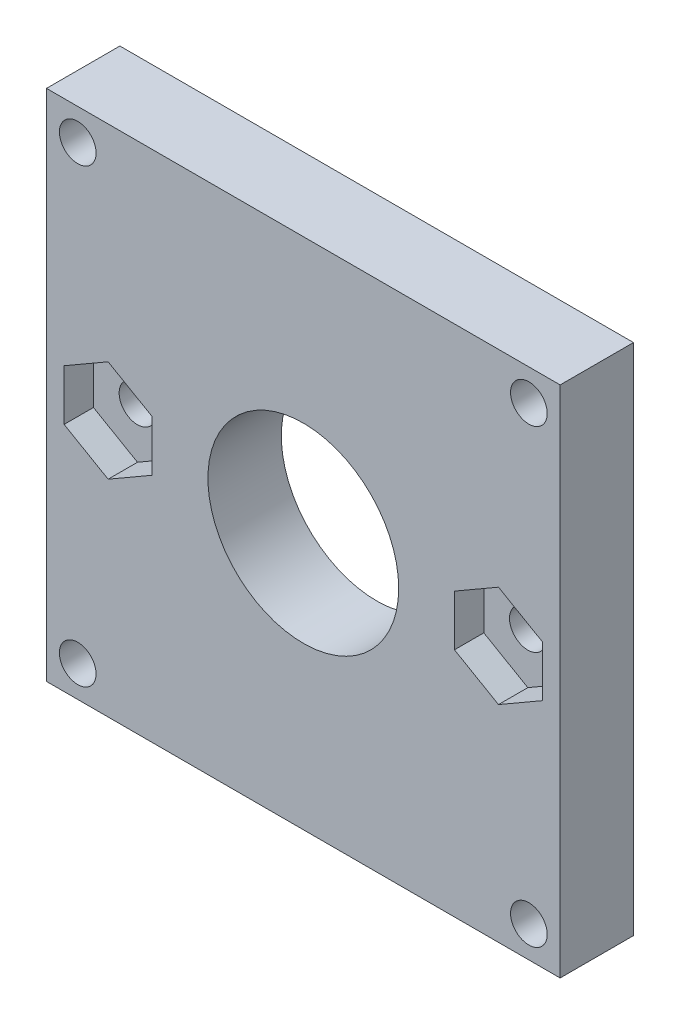
ISO-10303-21;
HEADER;
FILE_DESCRIPTION(('STEP AP214'),'2;1');
FILE_NAME('part.step','',(''),(''),'','','');
FILE_SCHEMA(('AUTOMOTIVE_DESIGN { 1 0 10303 214 1 1 1 1 }'));
ENDSEC;
DATA;
#1=APPLICATION_CONTEXT('core data for automotive mechanical design processes');
#2=APPLICATION_PROTOCOL_DEFINITION('international standard','automotive_design',2000,#1);
#3=PRODUCT_CONTEXT('',#1,'mechanical');
#4=PRODUCT('Part','Part','',(#3));
#5=PRODUCT_RELATED_PRODUCT_CATEGORY('part','',(#4));
#6=PRODUCT_DEFINITION_FORMATION('','',#4);
#7=PRODUCT_DEFINITION_CONTEXT('part definition',#1,'design');
#8=PRODUCT_DEFINITION('design','',#6,#7);
#9=PRODUCT_DEFINITION_SHAPE('','',#8);
#10=(LENGTH_UNIT() NAMED_UNIT(*) SI_UNIT(.MILLI.,.METRE.));
#11=(NAMED_UNIT(*) PLANE_ANGLE_UNIT() SI_UNIT($,.RADIAN.));
#12=(NAMED_UNIT(*) SI_UNIT($,.STERADIAN.) SOLID_ANGLE_UNIT());
#13=UNCERTAINTY_MEASURE_WITH_UNIT(LENGTH_MEASURE(1.E-05),#10,'distance_accuracy_value','');
#14=(GEOMETRIC_REPRESENTATION_CONTEXT(3) GLOBAL_UNCERTAINTY_ASSIGNED_CONTEXT((#13)) GLOBAL_UNIT_ASSIGNED_CONTEXT((#10,
#11,#12)) REPRESENTATION_CONTEXT('',''));
#15=CARTESIAN_POINT('',(0.,0.,0.));
#16=DIRECTION('',(0.,0.,1.));
#17=DIRECTION('',(1.,0.,0.));
#18=AXIS2_PLACEMENT_3D('',#15,#16,#17);
#19=CARTESIAN_POINT('',(-13.3,0.,5.));
#20=DIRECTION('',(0.,0.,-1.));
#21=DIRECTION('',(-1.,0.,0.));
#22=AXIS2_PLACEMENT_3D('',#19,#20,#21);
#23=CYLINDRICAL_SURFACE('',#22,1.25);
#24=CARTESIAN_POINT('',(-13.3,0.,0.));
#25=DIRECTION('',(0.,0.,1.));
#26=DIRECTION('',(1.,0.,0.));
#27=AXIS2_PLACEMENT_3D('',#24,#25,#26);
#28=CIRCLE('',#27,1.25);
#29=CARTESIAN_POINT('',(-12.05,0.,0.));
#30=VERTEX_POINT('',#29);
#31=EDGE_CURVE('E282',#30,#30,#28,.T.);
#32=ORIENTED_EDGE('',*,*,#31,.F.);
#33=EDGE_LOOP('',(#32));
#34=FACE_BOUND('',#33,.T.);
#35=CARTESIAN_POINT('',(-13.3,0.,3.));
#36=DIRECTION('',(0.,0.,1.));
#37=DIRECTION('',(1.,0.,0.));
#38=AXIS2_PLACEMENT_3D('',#35,#36,#37);
#39=CIRCLE('',#38,1.25);
#40=CARTESIAN_POINT('',(-12.05,0.,3.));
#41=VERTEX_POINT('',#40);
#42=EDGE_CURVE('E37',#41,#41,#39,.T.);
#43=ORIENTED_EDGE('',*,*,#42,.T.);
#44=EDGE_LOOP('',(#43));
#45=FACE_BOUND('',#44,.T.);
#46=ADVANCED_FACE('F33',(#34,#45),#23,.F.);
#47=CARTESIAN_POINT('',(13.3,0.,5.));
#48=DIRECTION('',(0.,0.,-1.));
#49=DIRECTION('',(-1.,0.,0.));
#50=AXIS2_PLACEMENT_3D('',#47,#48,#49);
#51=CYLINDRICAL_SURFACE('',#50,1.25);
#52=CARTESIAN_POINT('',(13.3,0.,0.));
#53=DIRECTION('',(0.,0.,1.));
#54=DIRECTION('',(1.,0.,0.));
#55=AXIS2_PLACEMENT_3D('',#52,#53,#54);
#56=CIRCLE('',#55,1.25);
#57=CARTESIAN_POINT('',(14.55,0.,0.));
#58=VERTEX_POINT('',#57);
#59=EDGE_CURVE('E279',#58,#58,#56,.T.);
#60=ORIENTED_EDGE('',*,*,#59,.F.);
#61=EDGE_LOOP('',(#60));
#62=FACE_BOUND('',#61,.T.);
#63=CARTESIAN_POINT('',(13.3,0.,3.));
#64=DIRECTION('',(0.,0.,1.));
#65=DIRECTION('',(1.,0.,0.));
#66=AXIS2_PLACEMENT_3D('',#63,#64,#65);
#67=CIRCLE('',#66,1.25);
#68=CARTESIAN_POINT('',(14.55,0.,3.));
#69=VERTEX_POINT('',#68);
#70=EDGE_CURVE('E195',#69,#69,#67,.T.);
#71=ORIENTED_EDGE('',*,*,#70,.T.);
#72=EDGE_LOOP('',(#71));
#73=FACE_BOUND('',#72,.T.);
#74=ADVANCED_FACE('F328',(#62,#73),#51,.F.);
#75=CARTESIAN_POINT('',(-17.5,0.,5.));
#76=DIRECTION('',(-1.,0.,0.));
#77=DIRECTION('',(0.,0.,1.));
#78=AXIS2_PLACEMENT_3D('',#75,#76,#77);
#79=PLANE('',#78);
#80=DIRECTION('',(0.,1.,0.));
#81=VECTOR('',#80,1.);
#82=CARTESIAN_POINT('',(-17.5,0.,0.));
#83=LINE('',#82,#81);
#84=CARTESIAN_POINT('',(-17.5,-17.5,0.));
#85=VERTEX_POINT('',#84);
#86=CARTESIAN_POINT('',(-17.5,17.5,0.));
#87=VERTEX_POINT('',#86);
#88=EDGE_CURVE('E297',#85,#87,#83,.T.);
#89=ORIENTED_EDGE('',*,*,#88,.F.);
#90=DIRECTION('',(0.,0.,-1.));
#91=VECTOR('',#90,1.);
#92=CARTESIAN_POINT('',(-17.5,-17.5,5.));
#93=LINE('',#92,#91);
#94=CARTESIAN_POINT('',(-17.5,-17.5,5.));
#95=VERTEX_POINT('',#94);
#96=EDGE_CURVE('E11',#95,#85,#93,.T.);
#97=ORIENTED_EDGE('',*,*,#96,.F.);
#98=DIRECTION('',(0.,1.,0.));
#99=VECTOR('',#98,1.);
#100=CARTESIAN_POINT('',(-17.5,0.,5.));
#101=LINE('',#100,#99);
#102=CARTESIAN_POINT('',(-17.5,17.5,5.));
#103=VERTEX_POINT('',#102);
#104=EDGE_CURVE('E264',#95,#103,#101,.T.);
#105=ORIENTED_EDGE('',*,*,#104,.T.);
#106=DIRECTION('',(0.,0.,-1.));
#107=VECTOR('',#106,1.);
#108=CARTESIAN_POINT('',(-17.5,17.5,5.));
#109=LINE('',#108,#107);
#110=EDGE_CURVE('E275',#103,#87,#109,.T.);
#111=ORIENTED_EDGE('',*,*,#110,.T.);
#112=EDGE_LOOP('',(#89,#97,#105,#111));
#113=FACE_BOUND('',#112,.T.);
#114=ADVANCED_FACE('F335',(#113),#79,.T.);
#115=CARTESIAN_POINT('',(0.,-17.5,5.));
#116=DIRECTION('',(0.,-1.,0.));
#117=DIRECTION('',(0.,0.,-1.));
#118=AXIS2_PLACEMENT_3D('',#115,#116,#117);
#119=PLANE('',#118);
#120=DIRECTION('',(-1.,0.,0.));
#121=VECTOR('',#120,1.);
#122=CARTESIAN_POINT('',(0.,-17.5,0.));
#123=LINE('',#122,#121);
#124=CARTESIAN_POINT('',(17.5,-17.5,0.));
#125=VERTEX_POINT('',#124);
#126=EDGE_CURVE('E300',#125,#85,#123,.T.);
#127=ORIENTED_EDGE('',*,*,#126,.F.);
#128=DIRECTION('',(0.,0.,-1.));
#129=VECTOR('',#128,1.);
#130=CARTESIAN_POINT('',(17.5,-17.5,5.));
#131=LINE('',#130,#129);
#132=CARTESIAN_POINT('',(17.5,-17.5,5.));
#133=VERTEX_POINT('',#132);
#134=EDGE_CURVE('E42',#133,#125,#131,.T.);
#135=ORIENTED_EDGE('',*,*,#134,.F.);
#136=DIRECTION('',(-1.,0.,0.));
#137=VECTOR('',#136,1.);
#138=CARTESIAN_POINT('',(0.,-17.5,5.));
#139=LINE('',#138,#137);
#140=EDGE_CURVE('E267',#133,#95,#139,.T.);
#141=ORIENTED_EDGE('',*,*,#140,.T.);
#142=ORIENTED_EDGE('',*,*,#96,.T.);
#143=EDGE_LOOP('',(#127,#135,#141,#142));
#144=FACE_BOUND('',#143,.T.);
#145=ADVANCED_FACE('F358',(#144),#119,.T.);
#146=CARTESIAN_POINT('',(17.5,0.,5.));
#147=DIRECTION('',(-1.,0.,0.));
#148=DIRECTION('',(0.,0.,1.));
#149=AXIS2_PLACEMENT_3D('',#146,#147,#148);
#150=PLANE('',#149);
#151=DIRECTION('',(0.,1.,0.));
#152=VECTOR('',#151,1.);
#153=CARTESIAN_POINT('',(17.5,0.,0.));
#154=LINE('',#153,#152);
#155=CARTESIAN_POINT('',(17.5,17.5,0.));
#156=VERTEX_POINT('',#155);
#157=EDGE_CURVE('E303',#125,#156,#154,.T.);
#158=ORIENTED_EDGE('',*,*,#157,.T.);
#159=DIRECTION('',(0.,0.,-1.));
#160=VECTOR('',#159,1.);
#161=CARTESIAN_POINT('',(17.5,17.5,5.));
#162=LINE('',#161,#160);
#163=CARTESIAN_POINT('',(17.5,17.5,5.));
#164=VERTEX_POINT('',#163);
#165=EDGE_CURVE('E309',#164,#156,#162,.T.);
#166=ORIENTED_EDGE('',*,*,#165,.F.);
#167=DIRECTION('',(0.,1.,0.));
#168=VECTOR('',#167,1.);
#169=CARTESIAN_POINT('',(17.5,0.,5.));
#170=LINE('',#169,#168);
#171=EDGE_CURVE('E270',#133,#164,#170,.T.);
#172=ORIENTED_EDGE('',*,*,#171,.F.);
#173=ORIENTED_EDGE('',*,*,#134,.T.);
#174=EDGE_LOOP('',(#158,#166,#172,#173));
#175=FACE_BOUND('',#174,.T.);
#176=ADVANCED_FACE('F354',(#175),#150,.F.);
#177=CARTESIAN_POINT('',(-15.37,15.37,5.));
#178=DIRECTION('',(0.,0.,-1.));
#179=DIRECTION('',(-1.,0.,0.));
#180=AXIS2_PLACEMENT_3D('',#177,#178,#179);
#181=CYLINDRICAL_SURFACE('',#180,1.25);
#182=CARTESIAN_POINT('',(-15.37,15.37,5.));
#183=DIRECTION('',(0.,0.,1.));
#184=DIRECTION('',(1.,0.,0.));
#185=AXIS2_PLACEMENT_3D('',#182,#183,#184);
#186=CIRCLE('',#185,1.25);
#187=CARTESIAN_POINT('',(-14.12,15.37,5.));
#188=VERTEX_POINT('',#187);
#189=EDGE_CURVE('E261',#188,#188,#186,.T.);
#190=ORIENTED_EDGE('',*,*,#189,.T.);
#191=EDGE_LOOP('',(#190));
#192=FACE_BOUND('',#191,.T.);
#193=CARTESIAN_POINT('',(-15.37,15.37,0.));
#194=DIRECTION('',(0.,0.,1.));
#195=DIRECTION('',(1.,0.,0.));
#196=AXIS2_PLACEMENT_3D('',#193,#194,#195);
#197=CIRCLE('',#196,1.25);
#198=CARTESIAN_POINT('',(-14.12,15.37,0.));
#199=VERTEX_POINT('',#198);
#200=EDGE_CURVE('E294',#199,#199,#197,.T.);
#201=ORIENTED_EDGE('',*,*,#200,.F.);
#202=EDGE_LOOP('',(#201));
#203=FACE_BOUND('',#202,.T.);
#204=ADVANCED_FACE('F350',(#192,#203),#181,.F.);
#205=CARTESIAN_POINT('',(15.37,15.37,5.));
#206=DIRECTION('',(0.,0.,-1.));
#207=DIRECTION('',(-1.,0.,0.));
#208=AXIS2_PLACEMENT_3D('',#205,#206,#207);
#209=CYLINDRICAL_SURFACE('',#208,1.25);
#210=CARTESIAN_POINT('',(15.37,15.37,5.));
#211=DIRECTION('',(0.,0.,1.));
#212=DIRECTION('',(1.,0.,0.));
#213=AXIS2_PLACEMENT_3D('',#210,#211,#212);
#214=CIRCLE('',#213,1.25);
#215=CARTESIAN_POINT('',(16.62,15.37,5.));
#216=VERTEX_POINT('',#215);
#217=EDGE_CURVE('E258',#216,#216,#214,.T.);
#218=ORIENTED_EDGE('',*,*,#217,.T.);
#219=EDGE_LOOP('',(#218));
#220=FACE_BOUND('',#219,.T.);
#221=CARTESIAN_POINT('',(15.37,15.37,0.));
#222=DIRECTION('',(0.,0.,1.));
#223=DIRECTION('',(1.,0.,0.));
#224=AXIS2_PLACEMENT_3D('',#221,#222,#223);
#225=CIRCLE('',#224,1.25);
#226=CARTESIAN_POINT('',(16.62,15.37,0.));
#227=VERTEX_POINT('',#226);
#228=EDGE_CURVE('E291',#227,#227,#225,.T.);
#229=ORIENTED_EDGE('',*,*,#228,.F.);
#230=EDGE_LOOP('',(#229));
#231=FACE_BOUND('',#230,.T.);
#232=ADVANCED_FACE('F346',(#220,#231),#209,.F.);
#233=CARTESIAN_POINT('',(15.37,-15.37,5.));
#234=DIRECTION('',(0.,0.,-1.));
#235=DIRECTION('',(-1.,0.,0.));
#236=AXIS2_PLACEMENT_3D('',#233,#234,#235);
#237=CYLINDRICAL_SURFACE('',#236,1.25);
#238=CARTESIAN_POINT('',(15.37,-15.37,5.));
#239=DIRECTION('',(0.,0.,1.));
#240=DIRECTION('',(1.,0.,0.));
#241=AXIS2_PLACEMENT_3D('',#238,#239,#240);
#242=CIRCLE('',#241,1.25);
#243=CARTESIAN_POINT('',(16.62,-15.37,5.));
#244=VERTEX_POINT('',#243);
#245=EDGE_CURVE('E255',#244,#244,#242,.T.);
#246=ORIENTED_EDGE('',*,*,#245,.T.);
#247=EDGE_LOOP('',(#246));
#248=FACE_BOUND('',#247,.T.);
#249=CARTESIAN_POINT('',(15.37,-15.37,0.));
#250=DIRECTION('',(0.,0.,1.));
#251=DIRECTION('',(1.,0.,0.));
#252=AXIS2_PLACEMENT_3D('',#249,#250,#251);
#253=CIRCLE('',#252,1.25);
#254=CARTESIAN_POINT('',(16.62,-15.37,0.));
#255=VERTEX_POINT('',#254);
#256=EDGE_CURVE('E288',#255,#255,#253,.T.);
#257=ORIENTED_EDGE('',*,*,#256,.F.);
#258=EDGE_LOOP('',(#257));
#259=FACE_BOUND('',#258,.T.);
#260=ADVANCED_FACE('F342',(#248,#259),#237,.F.);
#261=CARTESIAN_POINT('',(-15.37,-15.37,5.));
#262=DIRECTION('',(0.,0.,-1.));
#263=DIRECTION('',(-1.,0.,0.));
#264=AXIS2_PLACEMENT_3D('',#261,#262,#263);
#265=CYLINDRICAL_SURFACE('',#264,1.25);
#266=CARTESIAN_POINT('',(-15.37,-15.37,5.));
#267=DIRECTION('',(0.,0.,1.));
#268=DIRECTION('',(1.,0.,0.));
#269=AXIS2_PLACEMENT_3D('',#266,#267,#268);
#270=CIRCLE('',#269,1.25);
#271=CARTESIAN_POINT('',(-14.12,-15.37,5.));
#272=VERTEX_POINT('',#271);
#273=EDGE_CURVE('E251',#272,#272,#270,.T.);
#274=ORIENTED_EDGE('',*,*,#273,.T.);
#275=EDGE_LOOP('',(#274));
#276=FACE_BOUND('',#275,.T.);
#277=CARTESIAN_POINT('',(-15.37,-15.37,0.));
#278=DIRECTION('',(0.,0.,1.));
#279=DIRECTION('',(1.,0.,0.));
#280=AXIS2_PLACEMENT_3D('',#277,#278,#279);
#281=CIRCLE('',#280,1.25);
#282=CARTESIAN_POINT('',(-14.12,-15.37,0.));
#283=VERTEX_POINT('',#282);
#284=EDGE_CURVE('E285',#283,#283,#281,.T.);
#285=ORIENTED_EDGE('',*,*,#284,.F.);
#286=EDGE_LOOP('',(#285));
#287=FACE_BOUND('',#286,.T.);
#288=ADVANCED_FACE('F339',(#276,#287),#265,.F.);
#289=CARTESIAN_POINT('',(0.,0.,5.));
#290=DIRECTION('',(0.,0.,-1.));
#291=DIRECTION('',(-1.,0.,0.));
#292=AXIS2_PLACEMENT_3D('',#289,#290,#291);
#293=CYLINDRICAL_SURFACE('',#292,6.5);
#294=CARTESIAN_POINT('',(0.,0.,5.));
#295=DIRECTION('',(0.,0.,1.));
#296=DIRECTION('',(1.,0.,0.));
#297=AXIS2_PLACEMENT_3D('',#294,#295,#296);
#298=CIRCLE('',#297,6.5);
#299=CARTESIAN_POINT('',(6.5,0.,5.));
#300=VERTEX_POINT('',#299);
#301=EDGE_CURVE('E248',#300,#300,#298,.T.);
#302=ORIENTED_EDGE('',*,*,#301,.T.);
#303=EDGE_LOOP('',(#302));
#304=FACE_BOUND('',#303,.T.);
#305=CARTESIAN_POINT('',(0.,0.,0.));
#306=DIRECTION('',(0.,0.,1.));
#307=DIRECTION('',(1.,0.,0.));
#308=AXIS2_PLACEMENT_3D('',#305,#306,#307);
#309=CIRCLE('',#308,6.5);
#310=CARTESIAN_POINT('',(6.5,0.,0.));
#311=VERTEX_POINT('',#310);
#312=EDGE_CURVE('E276',#311,#311,#309,.T.);
#313=ORIENTED_EDGE('',*,*,#312,.F.);
#314=EDGE_LOOP('',(#313));
#315=FACE_BOUND('',#314,.T.);
#316=ADVANCED_FACE('F35',(#304,#315),#293,.F.);
#317=CARTESIAN_POINT('',(0.,17.5,5.));
#318=DIRECTION('',(0.,-1.,0.));
#319=DIRECTION('',(0.,0.,-1.));
#320=AXIS2_PLACEMENT_3D('',#317,#318,#319);
#321=PLANE('',#320);
#322=DIRECTION('',(-1.,0.,0.));
#323=VECTOR('',#322,1.);
#324=CARTESIAN_POINT('',(0.,17.5,0.));
#325=LINE('',#324,#323);
#326=EDGE_CURVE('E252',#156,#87,#325,.T.);
#327=ORIENTED_EDGE('',*,*,#326,.T.);
#328=ORIENTED_EDGE('',*,*,#110,.F.);
#329=DIRECTION('',(-1.,0.,0.));
#330=VECTOR('',#329,1.);
#331=CARTESIAN_POINT('',(0.,17.5,5.));
#332=LINE('',#331,#330);
#333=EDGE_CURVE('E273',#164,#103,#332,.T.);
#334=ORIENTED_EDGE('',*,*,#333,.F.);
#335=ORIENTED_EDGE('',*,*,#165,.T.);
#336=EDGE_LOOP('',(#327,#328,#334,#335));
#337=FACE_BOUND('',#336,.T.);
#338=ADVANCED_FACE('F366',(#337),#321,.F.);
#339=CARTESIAN_POINT('',(0.,0.,5.));
#340=DIRECTION('',(0.,0.,1.));
#341=DIRECTION('',(1.,0.,0.));
#342=AXIS2_PLACEMENT_3D('',#339,#340,#341);
#343=PLANE('',#342);
#344=DIRECTION('',(-0.866025403784438,0.5,0.));
#345=VECTOR('',#344,1.);
#346=CARTESIAN_POINT('',(-10.3,1.73205080756888,5.));
#347=LINE('',#346,#345);
#348=CARTESIAN_POINT('',(-10.3,1.73205080756888,5.));
#349=VERTEX_POINT('',#348);
#350=CARTESIAN_POINT('',(-13.3,3.46410161513776,5.));
#351=VERTEX_POINT('',#350);
#352=EDGE_CURVE('E50',#349,#351,#347,.T.);
#353=ORIENTED_EDGE('',*,*,#352,.F.);
#354=DIRECTION('',(0.,1.,0.));
#355=VECTOR('',#354,1.);
#356=CARTESIAN_POINT('',(-10.3,-1.73205080756888,5.));
#357=LINE('',#356,#355);
#358=CARTESIAN_POINT('',(-10.3,-1.73205080756888,5.));
#359=VERTEX_POINT('',#358);
#360=EDGE_CURVE('E168',#359,#349,#357,.T.);
#361=ORIENTED_EDGE('',*,*,#360,.F.);
#362=DIRECTION('',(0.866025403784438,0.5,0.));
#363=VECTOR('',#362,1.);
#364=CARTESIAN_POINT('',(-13.3,-3.46410161513776,5.));
#365=LINE('',#364,#363);
#366=CARTESIAN_POINT('',(-13.3,-3.46410161513776,5.));
#367=VERTEX_POINT('',#366);
#368=EDGE_CURVE('E171',#367,#359,#365,.T.);
#369=ORIENTED_EDGE('',*,*,#368,.F.);
#370=DIRECTION('',(0.866025403784439,-0.5,0.));
#371=VECTOR('',#370,1.);
#372=CARTESIAN_POINT('',(-16.3,-1.73205080756888,5.));
#373=LINE('',#372,#371);
#374=CARTESIAN_POINT('',(-16.3,-1.73205080756888,5.));
#375=VERTEX_POINT('',#374);
#376=EDGE_CURVE('E188',#375,#367,#373,.T.);
#377=ORIENTED_EDGE('',*,*,#376,.F.);
#378=DIRECTION('',(0.,-1.,0.));
#379=VECTOR('',#378,1.);
#380=CARTESIAN_POINT('',(-16.3,1.73205080756888,5.));
#381=LINE('',#380,#379);
#382=CARTESIAN_POINT('',(-16.3,1.73205080756888,5.));
#383=VERTEX_POINT('',#382);
#384=EDGE_CURVE('E185',#383,#375,#381,.T.);
#385=ORIENTED_EDGE('',*,*,#384,.F.);
#386=DIRECTION('',(-0.866025403784439,-0.5,0.));
#387=VECTOR('',#386,1.);
#388=CARTESIAN_POINT('',(-13.3,3.46410161513776,5.));
#389=LINE('',#388,#387);
#390=EDGE_CURVE('E182',#351,#383,#389,.T.);
#391=ORIENTED_EDGE('',*,*,#390,.F.);
#392=EDGE_LOOP('',(#353,#361,#369,#377,#385,#391));
#393=FACE_BOUND('',#392,.T.);
#394=DIRECTION('',(-0.866025403784441,0.499999999999995,0.));
#395=VECTOR('',#394,1.);
#396=CARTESIAN_POINT('',(16.3,1.73205080756891,5.));
#397=LINE('',#396,#395);
#398=CARTESIAN_POINT('',(16.3,1.73205080756891,5.));
#399=VERTEX_POINT('',#398);
#400=CARTESIAN_POINT('',(13.3,3.46410161513776,5.));
#401=VERTEX_POINT('',#400);
#402=EDGE_CURVE('E58',#399,#401,#397,.T.);
#403=ORIENTED_EDGE('',*,*,#402,.F.);
#404=DIRECTION('',(0.,1.,0.));
#405=VECTOR('',#404,1.);
#406=CARTESIAN_POINT('',(16.3,-1.73205080756885,5.));
#407=LINE('',#406,#405);
#408=CARTESIAN_POINT('',(16.3,-1.73205080756885,5.));
#409=VERTEX_POINT('',#408);
#410=EDGE_CURVE('E207',#409,#399,#407,.T.);
#411=ORIENTED_EDGE('',*,*,#410,.F.);
#412=DIRECTION('',(0.866025403784434,0.500000000000007,0.));
#413=VECTOR('',#412,1.);
#414=CARTESIAN_POINT('',(13.3,-3.46410161513776,5.));
#415=LINE('',#414,#413);
#416=CARTESIAN_POINT('',(13.3,-3.46410161513776,5.));
#417=VERTEX_POINT('',#416);
#418=EDGE_CURVE('E233',#417,#409,#415,.T.);
#419=ORIENTED_EDGE('',*,*,#418,.F.);
#420=DIRECTION('',(0.866025403784441,-0.499999999999995,0.));
#421=VECTOR('',#420,1.);
#422=CARTESIAN_POINT('',(10.3,-1.73205080756889,5.));
#423=LINE('',#422,#421);
#424=CARTESIAN_POINT('',(10.3,-1.73205080756889,5.));
#425=VERTEX_POINT('',#424);
#426=EDGE_CURVE('E230',#425,#417,#423,.T.);
#427=ORIENTED_EDGE('',*,*,#426,.F.);
#428=DIRECTION('',(0.,-1.,0.));
#429=VECTOR('',#428,1.);
#430=CARTESIAN_POINT('',(10.3,1.73205080756887,5.));
#431=LINE('',#430,#429);
#432=CARTESIAN_POINT('',(10.3,1.73205080756887,5.));
#433=VERTEX_POINT('',#432);
#434=EDGE_CURVE('E227',#433,#425,#431,.T.);
#435=ORIENTED_EDGE('',*,*,#434,.F.);
#436=DIRECTION('',(-0.866025403784438,-0.500000000000001,0.));
#437=VECTOR('',#436,1.);
#438=CARTESIAN_POINT('',(13.3,3.46410161513776,5.));
#439=LINE('',#438,#437);
#440=EDGE_CURVE('E224',#401,#433,#439,.T.);
#441=ORIENTED_EDGE('',*,*,#440,.F.);
#442=EDGE_LOOP('',(#403,#411,#419,#427,#435,#441));
#443=FACE_BOUND('',#442,.T.);
#444=ORIENTED_EDGE('',*,*,#301,.F.);
#445=EDGE_LOOP('',(#444));
#446=FACE_BOUND('',#445,.T.);
#447=ORIENTED_EDGE('',*,*,#273,.F.);
#448=EDGE_LOOP('',(#447));
#449=FACE_BOUND('',#448,.T.);
#450=ORIENTED_EDGE('',*,*,#245,.F.);
#451=EDGE_LOOP('',(#450));
#452=FACE_BOUND('',#451,.T.);
#453=ORIENTED_EDGE('',*,*,#217,.F.);
#454=EDGE_LOOP('',(#453));
#455=FACE_BOUND('',#454,.T.);
#456=ORIENTED_EDGE('',*,*,#189,.F.);
#457=EDGE_LOOP('',(#456));
#458=FACE_BOUND('',#457,.T.);
#459=ORIENTED_EDGE('',*,*,#104,.F.);
#460=ORIENTED_EDGE('',*,*,#140,.F.);
#461=ORIENTED_EDGE('',*,*,#171,.T.);
#462=ORIENTED_EDGE('',*,*,#333,.T.);
#463=EDGE_LOOP('',(#459,#460,#461,#462));
#464=FACE_BOUND('',#463,.T.);
#465=ADVANCED_FACE('F369',(#393,#443,#446,#449,#452,#455,#458,#464),#343,.T.);
#466=CARTESIAN_POINT('',(0.,0.,0.));
#467=DIRECTION('',(0.,0.,1.));
#468=DIRECTION('',(1.,0.,0.));
#469=AXIS2_PLACEMENT_3D('',#466,#467,#468);
#470=PLANE('',#469);
#471=ORIENTED_EDGE('',*,*,#312,.T.);
#472=EDGE_LOOP('',(#471));
#473=FACE_BOUND('',#472,.T.);
#474=ORIENTED_EDGE('',*,*,#59,.T.);
#475=EDGE_LOOP('',(#474));
#476=FACE_BOUND('',#475,.T.);
#477=ORIENTED_EDGE('',*,*,#31,.T.);
#478=EDGE_LOOP('',(#477));
#479=FACE_BOUND('',#478,.T.);
#480=ORIENTED_EDGE('',*,*,#284,.T.);
#481=EDGE_LOOP('',(#480));
#482=FACE_BOUND('',#481,.T.);
#483=ORIENTED_EDGE('',*,*,#256,.T.);
#484=EDGE_LOOP('',(#483));
#485=FACE_BOUND('',#484,.T.);
#486=ORIENTED_EDGE('',*,*,#228,.T.);
#487=EDGE_LOOP('',(#486));
#488=FACE_BOUND('',#487,.T.);
#489=ORIENTED_EDGE('',*,*,#200,.T.);
#490=EDGE_LOOP('',(#489));
#491=FACE_BOUND('',#490,.T.);
#492=ORIENTED_EDGE('',*,*,#88,.T.);
#493=ORIENTED_EDGE('',*,*,#326,.F.);
#494=ORIENTED_EDGE('',*,*,#157,.F.);
#495=ORIENTED_EDGE('',*,*,#126,.T.);
#496=EDGE_LOOP('',(#492,#493,#494,#495));
#497=FACE_BOUND('',#496,.T.);
#498=ADVANCED_FACE('F371',(#473,#476,#479,#482,#485,#488,#491,#497),#470,.F.);
#499=CARTESIAN_POINT('',(16.3,1.73205080756891,3.));
#500=DIRECTION('',(0.499999999999995,0.866025403784441,0.));
#501=DIRECTION('',(-0.866025403784442,0.499999999999995,0.));
#502=AXIS2_PLACEMENT_3D('',#499,#500,#501);
#503=PLANE('',#502);
#504=ORIENTED_EDGE('',*,*,#402,.T.);
#505=DIRECTION('',(0.,0.,1.));
#506=VECTOR('',#505,1.);
#507=CARTESIAN_POINT('',(13.3,3.46410161513776,3.));
#508=LINE('',#507,#506);
#509=CARTESIAN_POINT('',(13.3,3.46410161513776,3.));
#510=VERTEX_POINT('',#509);
#511=EDGE_CURVE('E222',#510,#401,#508,.T.);
#512=ORIENTED_EDGE('',*,*,#511,.F.);
#513=DIRECTION('',(-0.866025403784441,0.499999999999995,0.));
#514=VECTOR('',#513,1.);
#515=CARTESIAN_POINT('',(16.3,1.73205080756891,3.));
#516=LINE('',#515,#514);
#517=CARTESIAN_POINT('',(16.3,1.73205080756891,3.));
#518=VERTEX_POINT('',#517);
#519=EDGE_CURVE('E203',#518,#510,#516,.T.);
#520=ORIENTED_EDGE('',*,*,#519,.F.);
#521=DIRECTION('',(0.,0.,1.));
#522=VECTOR('',#521,1.);
#523=CARTESIAN_POINT('',(16.3,1.73205080756891,3.));
#524=LINE('',#523,#522);
#525=EDGE_CURVE('E183',#518,#399,#524,.T.);
#526=ORIENTED_EDGE('',*,*,#525,.T.);
#527=EDGE_LOOP('',(#504,#512,#520,#526));
#528=FACE_BOUND('',#527,.T.);
#529=ADVANCED_FACE('F374',(#528),#503,.F.);
#530=CARTESIAN_POINT('',(16.3,-1.73205080756885,3.));
#531=DIRECTION('',(1.,0.,0.));
#532=DIRECTION('',(0.,1.,0.));
#533=AXIS2_PLACEMENT_3D('',#530,#531,#532);
#534=PLANE('',#533);
#535=ORIENTED_EDGE('',*,*,#410,.T.);
#536=ORIENTED_EDGE('',*,*,#525,.F.);
#537=DIRECTION('',(0.,1.,0.));
#538=VECTOR('',#537,1.);
#539=CARTESIAN_POINT('',(16.3,-1.73205080756885,3.));
#540=LINE('',#539,#538);
#541=CARTESIAN_POINT('',(16.3,-1.73205080756885,3.));
#542=VERTEX_POINT('',#541);
#543=EDGE_CURVE('E219',#542,#518,#540,.T.);
#544=ORIENTED_EDGE('',*,*,#543,.F.);
#545=DIRECTION('',(0.,0.,1.));
#546=VECTOR('',#545,1.);
#547=CARTESIAN_POINT('',(16.3,-1.73205080756885,3.));
#548=LINE('',#547,#546);
#549=EDGE_CURVE('E239',#542,#409,#548,.T.);
#550=ORIENTED_EDGE('',*,*,#549,.T.);
#551=EDGE_LOOP('',(#535,#536,#544,#550));
#552=FACE_BOUND('',#551,.T.);
#553=ADVANCED_FACE('F381',(#552),#534,.F.);
#554=CARTESIAN_POINT('',(13.3,-3.46410161513776,3.));
#555=DIRECTION('',(0.500000000000007,-0.866025403784434,0.));
#556=DIRECTION('',(0.866025403784435,0.500000000000007,0.));
#557=AXIS2_PLACEMENT_3D('',#554,#555,#556);
#558=PLANE('',#557);
#559=ORIENTED_EDGE('',*,*,#418,.T.);
#560=ORIENTED_EDGE('',*,*,#549,.F.);
#561=DIRECTION('',(0.866025403784434,0.500000000000007,0.));
#562=VECTOR('',#561,1.);
#563=CARTESIAN_POINT('',(13.3,-3.46410161513776,3.));
#564=LINE('',#563,#562);
#565=CARTESIAN_POINT('',(13.3,-3.46410161513776,3.));
#566=VERTEX_POINT('',#565);
#567=EDGE_CURVE('E216',#566,#542,#564,.T.);
#568=ORIENTED_EDGE('',*,*,#567,.F.);
#569=DIRECTION('',(0.,0.,1.));
#570=VECTOR('',#569,1.);
#571=CARTESIAN_POINT('',(13.3,-3.46410161513776,3.));
#572=LINE('',#571,#570);
#573=EDGE_CURVE('E241',#566,#417,#572,.T.);
#574=ORIENTED_EDGE('',*,*,#573,.T.);
#575=EDGE_LOOP('',(#559,#560,#568,#574));
#576=FACE_BOUND('',#575,.T.);
#577=ADVANCED_FACE('F394',(#576),#558,.F.);
#578=CARTESIAN_POINT('',(10.3,-1.73205080756889,3.));
#579=DIRECTION('',(-0.499999999999995,-0.866025403784442,0.));
#580=DIRECTION('',(0.866025403784442,-0.499999999999995,0.));
#581=AXIS2_PLACEMENT_3D('',#578,#579,#580);
#582=PLANE('',#581);
#583=ORIENTED_EDGE('',*,*,#426,.T.);
#584=ORIENTED_EDGE('',*,*,#573,.F.);
#585=DIRECTION('',(0.866025403784441,-0.499999999999995,0.));
#586=VECTOR('',#585,1.);
#587=CARTESIAN_POINT('',(10.3,-1.73205080756889,3.));
#588=LINE('',#587,#586);
#589=CARTESIAN_POINT('',(10.3,-1.73205080756889,3.));
#590=VERTEX_POINT('',#589);
#591=EDGE_CURVE('E213',#590,#566,#588,.T.);
#592=ORIENTED_EDGE('',*,*,#591,.F.);
#593=DIRECTION('',(0.,0.,1.));
#594=VECTOR('',#593,1.);
#595=CARTESIAN_POINT('',(10.3,-1.73205080756889,3.));
#596=LINE('',#595,#594);
#597=EDGE_CURVE('E243',#590,#425,#596,.T.);
#598=ORIENTED_EDGE('',*,*,#597,.T.);
#599=EDGE_LOOP('',(#583,#584,#592,#598));
#600=FACE_BOUND('',#599,.T.);
#601=ADVANCED_FACE('F390',(#600),#582,.F.);
#602=CARTESIAN_POINT('',(10.3,1.73205080756887,3.));
#603=DIRECTION('',(-1.,0.,0.));
#604=DIRECTION('',(0.,-1.,0.));
#605=AXIS2_PLACEMENT_3D('',#602,#603,#604);
#606=PLANE('',#605);
#607=ORIENTED_EDGE('',*,*,#434,.T.);
#608=ORIENTED_EDGE('',*,*,#597,.F.);
#609=DIRECTION('',(0.,-1.,0.));
#610=VECTOR('',#609,1.);
#611=CARTESIAN_POINT('',(10.3,1.73205080756887,3.));
#612=LINE('',#611,#610);
#613=CARTESIAN_POINT('',(10.3,1.73205080756887,3.));
#614=VERTEX_POINT('',#613);
#615=EDGE_CURVE('E210',#614,#590,#612,.T.);
#616=ORIENTED_EDGE('',*,*,#615,.F.);
#617=DIRECTION('',(0.,0.,1.));
#618=VECTOR('',#617,1.);
#619=CARTESIAN_POINT('',(10.3,1.73205080756887,3.));
#620=LINE('',#619,#618);
#621=EDGE_CURVE('E245',#614,#433,#620,.T.);
#622=ORIENTED_EDGE('',*,*,#621,.T.);
#623=EDGE_LOOP('',(#607,#608,#616,#622));
#624=FACE_BOUND('',#623,.T.);
#625=ADVANCED_FACE('F386',(#624),#606,.F.);
#626=CARTESIAN_POINT('',(13.3,3.46410161513776,3.));
#627=DIRECTION('',(-0.500000000000001,0.866025403784438,0.));
#628=DIRECTION('',(-0.866025403784438,-0.500000000000001,0.));
#629=AXIS2_PLACEMENT_3D('',#626,#627,#628);
#630=PLANE('',#629);
#631=ORIENTED_EDGE('',*,*,#440,.T.);
#632=ORIENTED_EDGE('',*,*,#621,.F.);
#633=DIRECTION('',(-0.866025403784438,-0.500000000000001,0.));
#634=VECTOR('',#633,1.);
#635=CARTESIAN_POINT('',(13.3,3.46410161513776,3.));
#636=LINE('',#635,#634);
#637=EDGE_CURVE('E206',#510,#614,#636,.T.);
#638=ORIENTED_EDGE('',*,*,#637,.F.);
#639=ORIENTED_EDGE('',*,*,#511,.T.);
#640=EDGE_LOOP('',(#631,#632,#638,#639));
#641=FACE_BOUND('',#640,.T.);
#642=ADVANCED_FACE('F382',(#641),#630,.F.);
#643=CARTESIAN_POINT('',(0.,0.,3.));
#644=DIRECTION('',(0.,0.,1.));
#645=DIRECTION('',(1.,0.,0.));
#646=AXIS2_PLACEMENT_3D('',#643,#644,#645);
#647=PLANE('',#646);
#648=ORIENTED_EDGE('',*,*,#70,.F.);
#649=EDGE_LOOP('',(#648));
#650=FACE_BOUND('',#649,.T.);
#651=ORIENTED_EDGE('',*,*,#519,.T.);
#652=ORIENTED_EDGE('',*,*,#637,.T.);
#653=ORIENTED_EDGE('',*,*,#615,.T.);
#654=ORIENTED_EDGE('',*,*,#591,.T.);
#655=ORIENTED_EDGE('',*,*,#567,.T.);
#656=ORIENTED_EDGE('',*,*,#543,.T.);
#657=EDGE_LOOP('',(#651,#652,#653,#654,#655,#656));
#658=FACE_BOUND('',#657,.T.);
#659=ADVANCED_FACE('F385',(#650,#658),#647,.T.);
#660=CARTESIAN_POINT('',(-10.3,1.73205080756888,3.));
#661=DIRECTION('',(0.5,0.866025403784439,0.));
#662=DIRECTION('',(-0.866025403784438,0.5,0.));
#663=AXIS2_PLACEMENT_3D('',#660,#661,#662);
#664=PLANE('',#663);
#665=ORIENTED_EDGE('',*,*,#352,.T.);
#666=DIRECTION('',(0.,0.,1.));
#667=VECTOR('',#666,1.);
#668=CARTESIAN_POINT('',(-13.3,3.46410161513776,3.));
#669=LINE('',#668,#667);
#670=CARTESIAN_POINT('',(-13.3,3.46410161513776,3.));
#671=VERTEX_POINT('',#670);
#672=EDGE_CURVE('E145',#671,#351,#669,.T.);
#673=ORIENTED_EDGE('',*,*,#672,.F.);
#674=DIRECTION('',(-0.866025403784438,0.5,0.));
#675=VECTOR('',#674,1.);
#676=CARTESIAN_POINT('',(-10.3,1.73205080756888,3.));
#677=LINE('',#676,#675);
#678=CARTESIAN_POINT('',(-10.3,1.73205080756888,3.));
#679=VERTEX_POINT('',#678);
#680=EDGE_CURVE('E149',#679,#671,#677,.T.);
#681=ORIENTED_EDGE('',*,*,#680,.F.);
#682=DIRECTION('',(0.,0.,1.));
#683=VECTOR('',#682,1.);
#684=CARTESIAN_POINT('',(-10.3,1.73205080756888,3.));
#685=LINE('',#684,#683);
#686=EDGE_CURVE('E193',#679,#349,#685,.T.);
#687=ORIENTED_EDGE('',*,*,#686,.T.);
#688=EDGE_LOOP('',(#665,#673,#681,#687));
#689=FACE_BOUND('',#688,.T.);
#690=ADVANCED_FACE('F147',(#689),#664,.F.);
#691=CARTESIAN_POINT('',(-10.3,-1.73205080756888,3.));
#692=DIRECTION('',(1.,0.,0.));
#693=DIRECTION('',(0.,0.,-1.));
#694=AXIS2_PLACEMENT_3D('',#691,#692,#693);
#695=PLANE('',#694);
#696=ORIENTED_EDGE('',*,*,#360,.T.);
#697=ORIENTED_EDGE('',*,*,#686,.F.);
#698=DIRECTION('',(0.,1.,0.));
#699=VECTOR('',#698,1.);
#700=CARTESIAN_POINT('',(-10.3,-1.73205080756888,3.));
#701=LINE('',#700,#699);
#702=CARTESIAN_POINT('',(-10.3,-1.73205080756888,3.));
#703=VERTEX_POINT('',#702);
#704=EDGE_CURVE('E155',#703,#679,#701,.T.);
#705=ORIENTED_EDGE('',*,*,#704,.F.);
#706=DIRECTION('',(0.,0.,1.));
#707=VECTOR('',#706,1.);
#708=CARTESIAN_POINT('',(-10.3,-1.73205080756888,3.));
#709=LINE('',#708,#707);
#710=EDGE_CURVE('E196',#703,#359,#709,.T.);
#711=ORIENTED_EDGE('',*,*,#710,.T.);
#712=EDGE_LOOP('',(#696,#697,#705,#711));
#713=FACE_BOUND('',#712,.T.);
#714=ADVANCED_FACE('F406',(#713),#695,.F.);
#715=CARTESIAN_POINT('',(-13.3,-3.46410161513776,3.));
#716=DIRECTION('',(0.5,-0.866025403784439,0.));
#717=DIRECTION('',(0.866025403784438,0.5,0.));
#718=AXIS2_PLACEMENT_3D('',#715,#716,#717);
#719=PLANE('',#718);
#720=ORIENTED_EDGE('',*,*,#368,.T.);
#721=ORIENTED_EDGE('',*,*,#710,.F.);
#722=DIRECTION('',(0.866025403784438,0.5,0.));
#723=VECTOR('',#722,1.);
#724=CARTESIAN_POINT('',(-13.3,-3.46410161513776,3.));
#725=LINE('',#724,#723);
#726=CARTESIAN_POINT('',(-13.3,-3.46410161513776,3.));
#727=VERTEX_POINT('',#726);
#728=EDGE_CURVE('E178',#727,#703,#725,.T.);
#729=ORIENTED_EDGE('',*,*,#728,.F.);
#730=DIRECTION('',(0.,0.,1.));
#731=VECTOR('',#730,1.);
#732=CARTESIAN_POINT('',(-13.3,-3.46410161513776,3.));
#733=LINE('',#732,#731);
#734=EDGE_CURVE('E198',#727,#367,#733,.T.);
#735=ORIENTED_EDGE('',*,*,#734,.T.);
#736=EDGE_LOOP('',(#720,#721,#729,#735));
#737=FACE_BOUND('',#736,.T.);
#738=ADVANCED_FACE('F414',(#737),#719,.F.);
#739=CARTESIAN_POINT('',(-16.3,-1.73205080756888,3.));
#740=DIRECTION('',(-0.5,-0.866025403784439,0.));
#741=DIRECTION('',(0.866025403784439,-0.5,0.));
#742=AXIS2_PLACEMENT_3D('',#739,#740,#741);
#743=PLANE('',#742);
#744=ORIENTED_EDGE('',*,*,#376,.T.);
#745=ORIENTED_EDGE('',*,*,#734,.F.);
#746=DIRECTION('',(0.866025403784439,-0.5,0.));
#747=VECTOR('',#746,1.);
#748=CARTESIAN_POINT('',(-16.3,-1.73205080756888,3.));
#749=LINE('',#748,#747);
#750=CARTESIAN_POINT('',(-16.3,-1.73205080756888,3.));
#751=VERTEX_POINT('',#750);
#752=EDGE_CURVE('E175',#751,#727,#749,.T.);
#753=ORIENTED_EDGE('',*,*,#752,.F.);
#754=DIRECTION('',(0.,0.,1.));
#755=VECTOR('',#754,1.);
#756=CARTESIAN_POINT('',(-16.3,-1.73205080756888,3.));
#757=LINE('',#756,#755);
#758=EDGE_CURVE('E200',#751,#375,#757,.T.);
#759=ORIENTED_EDGE('',*,*,#758,.T.);
#760=EDGE_LOOP('',(#744,#745,#753,#759));
#761=FACE_BOUND('',#760,.T.);
#762=ADVANCED_FACE('F410',(#761),#743,.F.);
#763=CARTESIAN_POINT('',(-16.3,1.73205080756888,3.));
#764=DIRECTION('',(-1.,0.,0.));
#765=DIRECTION('',(0.,0.,1.));
#766=AXIS2_PLACEMENT_3D('',#763,#764,#765);
#767=PLANE('',#766);
#768=ORIENTED_EDGE('',*,*,#384,.T.);
#769=ORIENTED_EDGE('',*,*,#758,.F.);
#770=DIRECTION('',(0.,-1.,0.));
#771=VECTOR('',#770,1.);
#772=CARTESIAN_POINT('',(-16.3,1.73205080756888,3.));
#773=LINE('',#772,#771);
#774=CARTESIAN_POINT('',(-16.3,1.73205080756888,3.));
#775=VERTEX_POINT('',#774);
#776=EDGE_CURVE('E163',#775,#751,#773,.T.);
#777=ORIENTED_EDGE('',*,*,#776,.F.);
#778=DIRECTION('',(0.,0.,1.));
#779=VECTOR('',#778,1.);
#780=CARTESIAN_POINT('',(-16.3,1.73205080756888,3.));
#781=LINE('',#780,#779);
#782=EDGE_CURVE('E154',#775,#383,#781,.T.);
#783=ORIENTED_EDGE('',*,*,#782,.T.);
#784=EDGE_LOOP('',(#768,#769,#777,#783));
#785=FACE_BOUND('',#784,.T.);
#786=ADVANCED_FACE('F324',(#785),#767,.F.);
#787=CARTESIAN_POINT('',(-13.3,3.46410161513776,3.));
#788=DIRECTION('',(-0.5,0.866025403784439,0.));
#789=DIRECTION('',(-0.866025403784439,-0.5,0.));
#790=AXIS2_PLACEMENT_3D('',#787,#788,#789);
#791=PLANE('',#790);
#792=ORIENTED_EDGE('',*,*,#390,.T.);
#793=ORIENTED_EDGE('',*,*,#782,.F.);
#794=DIRECTION('',(-0.866025403784439,-0.5,0.));
#795=VECTOR('',#794,1.);
#796=CARTESIAN_POINT('',(-13.3,3.46410161513776,3.));
#797=LINE('',#796,#795);
#798=EDGE_CURVE('E158',#671,#775,#797,.T.);
#799=ORIENTED_EDGE('',*,*,#798,.F.);
#800=ORIENTED_EDGE('',*,*,#672,.T.);
#801=EDGE_LOOP('',(#792,#793,#799,#800));
#802=FACE_BOUND('',#801,.T.);
#803=ADVANCED_FACE('F159',(#802),#791,.F.);
#804=CARTESIAN_POINT('',(0.,0.,3.));
#805=DIRECTION('',(0.,0.,1.));
#806=DIRECTION('',(1.,0.,0.));
#807=AXIS2_PLACEMENT_3D('',#804,#805,#806);
#808=PLANE('',#807);
#809=ORIENTED_EDGE('',*,*,#42,.F.);
#810=EDGE_LOOP('',(#809));
#811=FACE_BOUND('',#810,.T.);
#812=ORIENTED_EDGE('',*,*,#680,.T.);
#813=ORIENTED_EDGE('',*,*,#798,.T.);
#814=ORIENTED_EDGE('',*,*,#776,.T.);
#815=ORIENTED_EDGE('',*,*,#752,.T.);
#816=ORIENTED_EDGE('',*,*,#728,.T.);
#817=ORIENTED_EDGE('',*,*,#704,.T.);
#818=EDGE_LOOP('',(#812,#813,#814,#815,#816,#817));
#819=FACE_BOUND('',#818,.T.);
#820=ADVANCED_FACE('F165',(#811,#819),#808,.T.);
#821=CLOSED_SHELL('',(#46,#74,#114,#145,#176,#204,#232,#260,#288,#316,#338,#465,#498,#529,#553,
#577,#601,#625,#642,#659,#690,#714,#738,#762,#786,#803,#820));
#822=MANIFOLD_SOLID_BREP('B2',#821);
#823=ADVANCED_BREP_SHAPE_REPRESENTATION('',(#18,#822),#14);
#824=SHAPE_DEFINITION_REPRESENTATION(#9,#823);
ENDSEC;
END-ISO-10303-21;
